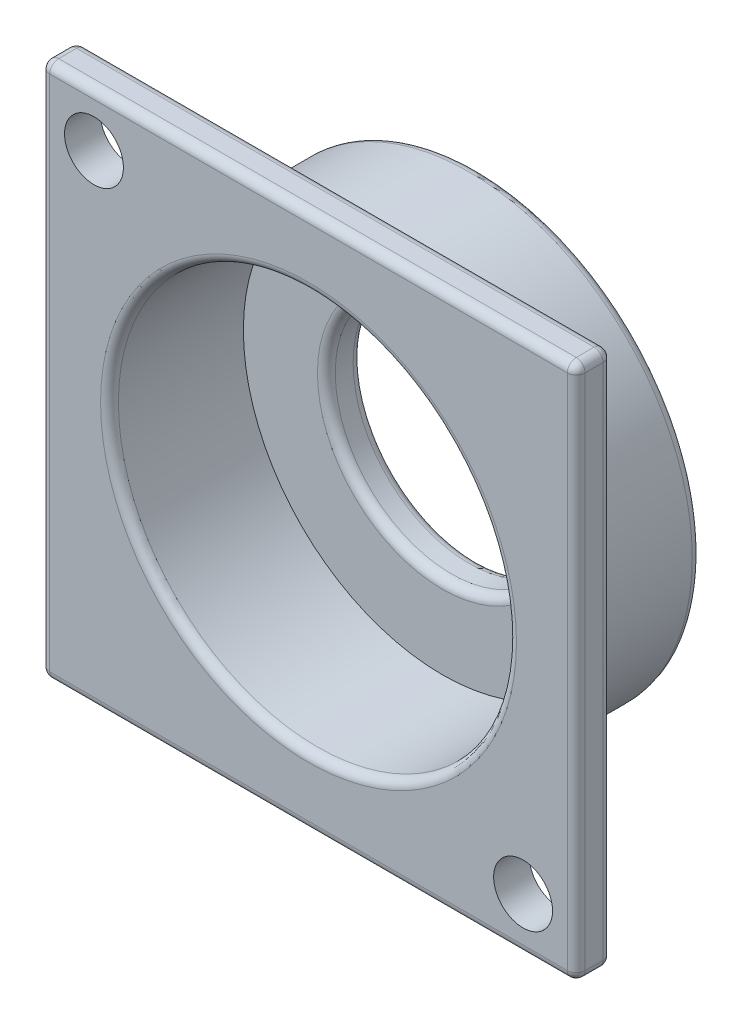
ISO-10303-21;
HEADER;
FILE_DESCRIPTION(('STEP AP214'),'2;1');
FILE_NAME('part.step','',(''),(''),'','','');
FILE_SCHEMA(('AUTOMOTIVE_DESIGN { 1 0 10303 214 1 1 1 1 }'));
ENDSEC;
DATA;
#1=APPLICATION_CONTEXT('core data for automotive mechanical design processes');
#2=APPLICATION_PROTOCOL_DEFINITION('international standard','automotive_design',2000,#1);
#3=PRODUCT_CONTEXT('',#1,'mechanical');
#4=PRODUCT('Part','Part','',(#3));
#5=PRODUCT_RELATED_PRODUCT_CATEGORY('part','',(#4));
#6=PRODUCT_DEFINITION_FORMATION('','',#4);
#7=PRODUCT_DEFINITION_CONTEXT('part definition',#1,'design');
#8=PRODUCT_DEFINITION('design','',#6,#7);
#9=PRODUCT_DEFINITION_SHAPE('','',#8);
#10=(LENGTH_UNIT() NAMED_UNIT(*) SI_UNIT(.MILLI.,.METRE.));
#11=(NAMED_UNIT(*) PLANE_ANGLE_UNIT() SI_UNIT($,.RADIAN.));
#12=(NAMED_UNIT(*) SI_UNIT($,.STERADIAN.) SOLID_ANGLE_UNIT());
#13=UNCERTAINTY_MEASURE_WITH_UNIT(LENGTH_MEASURE(1.E-05),#10,'distance_accuracy_value','');
#14=(GEOMETRIC_REPRESENTATION_CONTEXT(3) GLOBAL_UNCERTAINTY_ASSIGNED_CONTEXT((#13)) GLOBAL_UNIT_ASSIGNED_CONTEXT((#10,
#11,#12)) REPRESENTATION_CONTEXT('',''));
#15=CARTESIAN_POINT('',(0.,0.,0.));
#16=DIRECTION('',(0.,0.,1.));
#17=DIRECTION('',(1.,0.,0.));
#18=AXIS2_PLACEMENT_3D('',#15,#16,#17);
#19=CARTESIAN_POINT('',(-15.,0.,-2.));
#20=DIRECTION('',(1.,0.,0.));
#21=DIRECTION('',(0.,1.,0.));
#22=AXIS2_PLACEMENT_3D('',#19,#20,#21);
#23=PLANE('',#22);
#24=DIRECTION('',(0.,1.,0.));
#25=VECTOR('',#24,1.);
#26=CARTESIAN_POINT('',(-15.,0.,-1.5));
#27=LINE('',#26,#25);
#28=CARTESIAN_POINT('',(-15.,14.5,-1.5));
#29=VERTEX_POINT('',#28);
#30=CARTESIAN_POINT('',(-15.,-14.5,-1.5));
#31=VERTEX_POINT('',#30);
#32=EDGE_CURVE('E205',#29,#31,#27,.F.);
#33=ORIENTED_EDGE('',*,*,#32,.T.);
#34=DIRECTION('',(0.,0.,1.));
#35=VECTOR('',#34,1.);
#36=CARTESIAN_POINT('',(-15.,-14.5,-2.));
#37=LINE('',#36,#35);
#38=CARTESIAN_POINT('',(-15.,-14.5,-0.5));
#39=VERTEX_POINT('',#38);
#40=EDGE_CURVE('E207',#31,#39,#37,.T.);
#41=ORIENTED_EDGE('',*,*,#40,.T.);
#42=DIRECTION('',(0.,1.,0.));
#43=VECTOR('',#42,1.);
#44=CARTESIAN_POINT('',(-15.,15.,-0.5));
#45=LINE('',#44,#43);
#46=CARTESIAN_POINT('',(-15.,14.5,-0.5));
#47=VERTEX_POINT('',#46);
#48=EDGE_CURVE('E204',#39,#47,#45,.T.);
#49=ORIENTED_EDGE('',*,*,#48,.T.);
#50=DIRECTION('',(0.,0.,1.));
#51=VECTOR('',#50,1.);
#52=CARTESIAN_POINT('',(-15.,14.5,-2.));
#53=LINE('',#52,#51);
#54=EDGE_CURVE('E199',#47,#29,#53,.F.);
#55=ORIENTED_EDGE('',*,*,#54,.T.);
#56=EDGE_LOOP('',(#33,#41,#49,#55));
#57=FACE_BOUND('',#56,.T.);
#58=ADVANCED_FACE('F41',(#57),#23,.F.);
#59=CARTESIAN_POINT('',(0.,15.,-2.));
#60=DIRECTION('',(0.,1.,0.));
#61=DIRECTION('',(-1.,0.,0.));
#62=AXIS2_PLACEMENT_3D('',#59,#60,#61);
#63=PLANE('',#62);
#64=DIRECTION('',(-1.,0.,0.));
#65=VECTOR('',#64,1.);
#66=CARTESIAN_POINT('',(-15.,15.,-1.5));
#67=LINE('',#66,#65);
#68=CARTESIAN_POINT('',(14.5,15.,-1.5));
#69=VERTEX_POINT('',#68);
#70=CARTESIAN_POINT('',(-14.5,15.,-1.5));
#71=VERTEX_POINT('',#70);
#72=EDGE_CURVE('E146',#69,#71,#67,.T.);
#73=ORIENTED_EDGE('',*,*,#72,.T.);
#74=DIRECTION('',(0.,0.,1.));
#75=VECTOR('',#74,1.);
#76=CARTESIAN_POINT('',(-14.5,15.,0.));
#77=LINE('',#76,#75);
#78=CARTESIAN_POINT('',(-14.5,15.,-0.5));
#79=VERTEX_POINT('',#78);
#80=EDGE_CURVE('E211',#71,#79,#77,.T.);
#81=ORIENTED_EDGE('',*,*,#80,.T.);
#82=DIRECTION('',(-1.,0.,0.));
#83=VECTOR('',#82,1.);
#84=CARTESIAN_POINT('',(0.,15.,-0.5));
#85=LINE('',#84,#83);
#86=CARTESIAN_POINT('',(14.5,15.,-0.5));
#87=VERTEX_POINT('',#86);
#88=EDGE_CURVE('E212',#79,#87,#85,.F.);
#89=ORIENTED_EDGE('',*,*,#88,.T.);
#90=DIRECTION('',(0.,0.,1.));
#91=VECTOR('',#90,1.);
#92=CARTESIAN_POINT('',(14.5,15.,-2.));
#93=LINE('',#92,#91);
#94=EDGE_CURVE('E209',#87,#69,#93,.F.);
#95=ORIENTED_EDGE('',*,*,#94,.T.);
#96=EDGE_LOOP('',(#73,#81,#89,#95));
#97=FACE_BOUND('',#96,.T.);
#98=ADVANCED_FACE('F335',(#97),#63,.T.);
#99=CARTESIAN_POINT('',(15.,0.,-2.));
#100=DIRECTION('',(1.,0.,0.));
#101=DIRECTION('',(0.,1.,0.));
#102=AXIS2_PLACEMENT_3D('',#99,#100,#101);
#103=PLANE('',#102);
#104=DIRECTION('',(0.,1.,0.));
#105=VECTOR('',#104,1.);
#106=CARTESIAN_POINT('',(15.,15.,-1.5));
#107=LINE('',#106,#105);
#108=CARTESIAN_POINT('',(15.,-14.5,-1.5));
#109=VERTEX_POINT('',#108);
#110=CARTESIAN_POINT('',(15.,14.5,-1.5));
#111=VERTEX_POINT('',#110);
#112=EDGE_CURVE('E59',#109,#111,#107,.T.);
#113=ORIENTED_EDGE('',*,*,#112,.T.);
#114=DIRECTION('',(0.,0.,1.));
#115=VECTOR('',#114,1.);
#116=CARTESIAN_POINT('',(15.,14.5,-2.));
#117=LINE('',#116,#115);
#118=CARTESIAN_POINT('',(15.,14.5,-0.5));
#119=VERTEX_POINT('',#118);
#120=EDGE_CURVE('E223',#111,#119,#117,.T.);
#121=ORIENTED_EDGE('',*,*,#120,.T.);
#122=DIRECTION('',(0.,1.,0.));
#123=VECTOR('',#122,1.);
#124=CARTESIAN_POINT('',(15.,0.,-0.5));
#125=LINE('',#124,#123);
#126=CARTESIAN_POINT('',(15.,-14.5,-0.5));
#127=VERTEX_POINT('',#126);
#128=EDGE_CURVE('E220',#119,#127,#125,.F.);
#129=ORIENTED_EDGE('',*,*,#128,.T.);
#130=DIRECTION('',(0.,0.,1.));
#131=VECTOR('',#130,1.);
#132=CARTESIAN_POINT('',(15.,-14.5,-2.));
#133=LINE('',#132,#131);
#134=EDGE_CURVE('E64',#127,#109,#133,.F.);
#135=ORIENTED_EDGE('',*,*,#134,.T.);
#136=EDGE_LOOP('',(#113,#121,#129,#135));
#137=FACE_BOUND('',#136,.T.);
#138=ADVANCED_FACE('F342',(#137),#103,.T.);
#139=CARTESIAN_POINT('',(12.0208152801713,-12.0208152801714,-2.));
#140=DIRECTION('',(0.,0.,1.));
#141=DIRECTION('',(1.,0.,0.));
#142=AXIS2_PLACEMENT_3D('',#139,#140,#141);
#143=CYLINDRICAL_SURFACE('',#142,1.65);
#144=CARTESIAN_POINT('',(12.0208152801713,-12.0208152801714,-2.));
#145=DIRECTION('',(0.,0.,1.));
#146=DIRECTION('',(1.,0.,0.));
#147=AXIS2_PLACEMENT_3D('',#144,#145,#146);
#148=CIRCLE('',#147,1.65);
#149=CARTESIAN_POINT('',(13.6708152801713,-12.0208152801714,-2.));
#150=VERTEX_POINT('',#149);
#151=EDGE_CURVE('E170',#150,#150,#148,.T.);
#152=ORIENTED_EDGE('',*,*,#151,.F.);
#153=EDGE_LOOP('',(#152));
#154=FACE_BOUND('',#153,.T.);
#155=CARTESIAN_POINT('',(12.0208152801713,-12.0208152801714,0.));
#156=DIRECTION('',(0.,0.,1.));
#157=DIRECTION('',(1.,0.,0.));
#158=AXIS2_PLACEMENT_3D('',#155,#156,#157);
#159=CIRCLE('',#158,1.65);
#160=CARTESIAN_POINT('',(13.6708152801713,-12.0208152801714,0.));
#161=VERTEX_POINT('',#160);
#162=EDGE_CURVE('E173',#161,#161,#159,.T.);
#163=ORIENTED_EDGE('',*,*,#162,.T.);
#164=EDGE_LOOP('',(#163));
#165=FACE_BOUND('',#164,.T.);
#166=ADVANCED_FACE('F314',(#154,#165),#143,.F.);
#167=CARTESIAN_POINT('',(-12.0208152801712,12.0208152801714,-2.));
#168=DIRECTION('',(0.,0.,1.));
#169=DIRECTION('',(1.,0.,0.));
#170=AXIS2_PLACEMENT_3D('',#167,#168,#169);
#171=CYLINDRICAL_SURFACE('',#170,1.65);
#172=CARTESIAN_POINT('',(-12.0208152801712,12.0208152801714,-2.));
#173=DIRECTION('',(0.,0.,1.));
#174=DIRECTION('',(1.,0.,0.));
#175=AXIS2_PLACEMENT_3D('',#172,#173,#174);
#176=CIRCLE('',#175,1.65);
#177=CARTESIAN_POINT('',(-10.3708152801712,12.0208152801714,-2.));
#178=VERTEX_POINT('',#177);
#179=EDGE_CURVE('E167',#178,#178,#176,.T.);
#180=ORIENTED_EDGE('',*,*,#179,.F.);
#181=EDGE_LOOP('',(#180));
#182=FACE_BOUND('',#181,.T.);
#183=CARTESIAN_POINT('',(-12.0208152801712,12.0208152801714,0.));
#184=DIRECTION('',(0.,0.,1.));
#185=DIRECTION('',(1.,0.,0.));
#186=AXIS2_PLACEMENT_3D('',#183,#184,#185);
#187=CIRCLE('',#186,1.65);
#188=CARTESIAN_POINT('',(-10.3708152801712,12.0208152801714,0.));
#189=VERTEX_POINT('',#188);
#190=EDGE_CURVE('E304',#189,#189,#187,.T.);
#191=ORIENTED_EDGE('',*,*,#190,.T.);
#192=EDGE_LOOP('',(#191));
#193=FACE_BOUND('',#192,.T.);
#194=ADVANCED_FACE('F348',(#182,#193),#171,.F.);
#195=CARTESIAN_POINT('',(0.,0.,-2.));
#196=DIRECTION('',(0.,0.,1.));
#197=DIRECTION('',(1.,0.,0.));
#198=AXIS2_PLACEMENT_3D('',#195,#196,#197);
#199=CYLINDRICAL_SURFACE('',#198,11.15);
#200=CARTESIAN_POINT('',(0.,0.,-0.5));
#201=DIRECTION('',(0.,0.,1.));
#202=DIRECTION('',(1.,0.,0.));
#203=AXIS2_PLACEMENT_3D('',#200,#201,#202);
#204=CIRCLE('',#203,11.15);
#205=CARTESIAN_POINT('',(11.15,0.,-0.5));
#206=VERTEX_POINT('',#205);
#207=EDGE_CURVE('E222',#206,#206,#204,.T.);
#208=ORIENTED_EDGE('',*,*,#207,.T.);
#209=EDGE_LOOP('',(#208));
#210=FACE_BOUND('',#209,.T.);
#211=CARTESIAN_POINT('',(0.,0.,-7.5));
#212=DIRECTION('',(0.,0.,1.));
#213=DIRECTION('',(1.,0.,0.));
#214=AXIS2_PLACEMENT_3D('',#211,#212,#213);
#215=CIRCLE('',#214,11.15);
#216=CARTESIAN_POINT('',(11.15,0.,-7.5));
#217=VERTEX_POINT('',#216);
#218=EDGE_CURVE('E295',#217,#217,#215,.T.);
#219=ORIENTED_EDGE('',*,*,#218,.F.);
#220=EDGE_LOOP('',(#219));
#221=FACE_BOUND('',#220,.T.);
#222=ADVANCED_FACE('F353',(#210,#221),#199,.F.);
#223=CARTESIAN_POINT('',(0.,-15.,-2.));
#224=DIRECTION('',(0.,1.,0.));
#225=DIRECTION('',(-1.,0.,0.));
#226=AXIS2_PLACEMENT_3D('',#223,#224,#225);
#227=PLANE('',#226);
#228=DIRECTION('',(-1.,0.,0.));
#229=VECTOR('',#228,1.);
#230=CARTESIAN_POINT('',(-15.,-15.,-0.5));
#231=LINE('',#230,#229);
#232=CARTESIAN_POINT('',(14.5,-15.,-0.5));
#233=VERTEX_POINT('',#232);
#234=CARTESIAN_POINT('',(-14.5,-15.,-0.5));
#235=VERTEX_POINT('',#234);
#236=EDGE_CURVE('E181',#233,#235,#231,.T.);
#237=ORIENTED_EDGE('',*,*,#236,.T.);
#238=DIRECTION('',(0.,0.,1.));
#239=VECTOR('',#238,1.);
#240=CARTESIAN_POINT('',(-14.5,-15.,-2.));
#241=LINE('',#240,#239);
#242=CARTESIAN_POINT('',(-14.5,-15.,-1.5));
#243=VERTEX_POINT('',#242);
#244=EDGE_CURVE('E187',#235,#243,#241,.F.);
#245=ORIENTED_EDGE('',*,*,#244,.T.);
#246=DIRECTION('',(-1.,0.,0.));
#247=VECTOR('',#246,1.);
#248=CARTESIAN_POINT('',(0.,-15.,-1.5));
#249=LINE('',#248,#247);
#250=CARTESIAN_POINT('',(14.5,-15.,-1.5));
#251=VERTEX_POINT('',#250);
#252=EDGE_CURVE('E182',#243,#251,#249,.F.);
#253=ORIENTED_EDGE('',*,*,#252,.T.);
#254=DIRECTION('',(0.,0.,1.));
#255=VECTOR('',#254,1.);
#256=CARTESIAN_POINT('',(14.5,-15.,0.));
#257=LINE('',#256,#255);
#258=EDGE_CURVE('E177',#251,#233,#257,.T.);
#259=ORIENTED_EDGE('',*,*,#258,.T.);
#260=EDGE_LOOP('',(#237,#245,#253,#259));
#261=FACE_BOUND('',#260,.T.);
#262=ADVANCED_FACE('F327',(#261),#227,.F.);
#263=CARTESIAN_POINT('',(0.,0.,-2.));
#264=DIRECTION('',(0.,0.,1.));
#265=DIRECTION('',(1.,0.,0.));
#266=AXIS2_PLACEMENT_3D('',#263,#264,#265);
#267=PLANE('',#266);
#268=DIRECTION('',(0.,1.,0.));
#269=VECTOR('',#268,1.);
#270=CARTESIAN_POINT('',(14.5,-15.,-2.));
#271=LINE('',#270,#269);
#272=CARTESIAN_POINT('',(14.5,14.5,-2.));
#273=VERTEX_POINT('',#272);
#274=CARTESIAN_POINT('',(14.5,-14.5,-2.));
#275=VERTEX_POINT('',#274);
#276=EDGE_CURVE('E138',#273,#275,#271,.F.);
#277=ORIENTED_EDGE('',*,*,#276,.T.);
#278=DIRECTION('',(-1.,0.,0.));
#279=VECTOR('',#278,1.);
#280=CARTESIAN_POINT('',(0.,-14.5,-2.));
#281=LINE('',#280,#279);
#282=CARTESIAN_POINT('',(-14.5,-14.5,-2.));
#283=VERTEX_POINT('',#282);
#284=EDGE_CURVE('E180',#275,#283,#281,.T.);
#285=ORIENTED_EDGE('',*,*,#284,.T.);
#286=DIRECTION('',(0.,1.,0.));
#287=VECTOR('',#286,1.);
#288=CARTESIAN_POINT('',(-14.5,0.,-2.));
#289=LINE('',#288,#287);
#290=CARTESIAN_POINT('',(-14.5,14.5,-2.));
#291=VERTEX_POINT('',#290);
#292=EDGE_CURVE('E140',#283,#291,#289,.T.);
#293=ORIENTED_EDGE('',*,*,#292,.T.);
#294=DIRECTION('',(-1.,0.,0.));
#295=VECTOR('',#294,1.);
#296=CARTESIAN_POINT('',(15.,14.5,-2.));
#297=LINE('',#296,#295);
#298=EDGE_CURVE('E128',#291,#273,#297,.F.);
#299=ORIENTED_EDGE('',*,*,#298,.T.);
#300=EDGE_LOOP('',(#277,#285,#293,#299));
#301=FACE_BOUND('',#300,.T.);
#302=CARTESIAN_POINT('',(0.,0.,-2.));
#303=DIRECTION('',(0.,0.,1.));
#304=DIRECTION('',(1.,0.,0.));
#305=AXIS2_PLACEMENT_3D('',#302,#303,#304);
#306=CIRCLE('',#305,12.5);
#307=CARTESIAN_POINT('',(12.5,0.,-2.));
#308=VERTEX_POINT('',#307);
#309=EDGE_CURVE('E297',#308,#308,#306,.T.);
#310=ORIENTED_EDGE('',*,*,#309,.T.);
#311=EDGE_LOOP('',(#310));
#312=FACE_BOUND('',#311,.T.);
#313=ORIENTED_EDGE('',*,*,#179,.T.);
#314=EDGE_LOOP('',(#313));
#315=FACE_BOUND('',#314,.T.);
#316=ORIENTED_EDGE('',*,*,#151,.T.);
#317=EDGE_LOOP('',(#316));
#318=FACE_BOUND('',#317,.T.);
#319=ADVANCED_FACE('F135',(#301,#312,#315,#318),#267,.F.);
#320=CARTESIAN_POINT('',(0.,0.,0.));
#321=DIRECTION('',(0.,0.,1.));
#322=DIRECTION('',(1.,0.,0.));
#323=AXIS2_PLACEMENT_3D('',#320,#321,#322);
#324=PLANE('',#323);
#325=DIRECTION('',(0.,1.,0.));
#326=VECTOR('',#325,1.);
#327=CARTESIAN_POINT('',(-14.5,-15.,0.));
#328=LINE('',#327,#326);
#329=CARTESIAN_POINT('',(-14.5,14.5,0.));
#330=VERTEX_POINT('',#329);
#331=CARTESIAN_POINT('',(-14.5,-14.5,0.));
#332=VERTEX_POINT('',#331);
#333=EDGE_CURVE('E193',#330,#332,#328,.F.);
#334=ORIENTED_EDGE('',*,*,#333,.T.);
#335=DIRECTION('',(-1.,0.,0.));
#336=VECTOR('',#335,1.);
#337=CARTESIAN_POINT('',(15.,-14.5,0.));
#338=LINE('',#337,#336);
#339=CARTESIAN_POINT('',(14.5,-14.5,0.));
#340=VERTEX_POINT('',#339);
#341=EDGE_CURVE('E200',#332,#340,#338,.F.);
#342=ORIENTED_EDGE('',*,*,#341,.T.);
#343=DIRECTION('',(0.,1.,0.));
#344=VECTOR('',#343,1.);
#345=CARTESIAN_POINT('',(14.5,0.,0.));
#346=LINE('',#345,#344);
#347=CARTESIAN_POINT('',(14.5,14.5,0.));
#348=VERTEX_POINT('',#347);
#349=EDGE_CURVE('E192',#340,#348,#346,.T.);
#350=ORIENTED_EDGE('',*,*,#349,.T.);
#351=DIRECTION('',(-1.,0.,0.));
#352=VECTOR('',#351,1.);
#353=CARTESIAN_POINT('',(0.,14.5,0.));
#354=LINE('',#353,#352);
#355=EDGE_CURVE('E194',#348,#330,#354,.T.);
#356=ORIENTED_EDGE('',*,*,#355,.T.);
#357=EDGE_LOOP('',(#334,#342,#350,#356));
#358=FACE_BOUND('',#357,.T.);
#359=CARTESIAN_POINT('',(0.,0.,0.));
#360=DIRECTION('',(0.,0.,1.));
#361=DIRECTION('',(1.,0.,0.));
#362=AXIS2_PLACEMENT_3D('',#359,#360,#361);
#363=CIRCLE('',#362,11.65);
#364=CARTESIAN_POINT('',(11.65,0.,0.));
#365=VERTEX_POINT('',#364);
#366=EDGE_CURVE('E189',#365,#365,#363,.F.);
#367=ORIENTED_EDGE('',*,*,#366,.T.);
#368=EDGE_LOOP('',(#367));
#369=FACE_BOUND('',#368,.T.);
#370=ORIENTED_EDGE('',*,*,#190,.F.);
#371=EDGE_LOOP('',(#370));
#372=FACE_BOUND('',#371,.T.);
#373=ORIENTED_EDGE('',*,*,#162,.F.);
#374=EDGE_LOOP('',(#373));
#375=FACE_BOUND('',#374,.T.);
#376=ADVANCED_FACE('F320',(#358,#369,#372,#375),#324,.T.);
#377=CARTESIAN_POINT('',(0.,0.,-7.5));
#378=DIRECTION('',(0.,0.,1.));
#379=DIRECTION('',(1.,0.,0.));
#380=AXIS2_PLACEMENT_3D('',#377,#378,#379);
#381=CYLINDRICAL_SURFACE('',#380,12.5);
#382=CARTESIAN_POINT('',(0.,0.,-9.));
#383=DIRECTION('',(0.,0.,-1.));
#384=DIRECTION('',(-1.,0.,0.));
#385=AXIS2_PLACEMENT_3D('',#382,#383,#384);
#386=CIRCLE('',#385,12.5);
#387=CARTESIAN_POINT('',(-12.5,0.,-9.));
#388=VERTEX_POINT('',#387);
#389=EDGE_CURVE('E235',#388,#388,#386,.F.);
#390=ORIENTED_EDGE('',*,*,#389,.T.);
#391=EDGE_LOOP('',(#390));
#392=FACE_BOUND('',#391,.T.);
#393=ORIENTED_EDGE('',*,*,#309,.F.);
#394=EDGE_LOOP('',(#393));
#395=FACE_BOUND('',#394,.T.);
#396=ADVANCED_FACE('F316',(#392,#395),#381,.T.);
#397=CARTESIAN_POINT('',(0.,0.,-7.5));
#398=DIRECTION('',(0.,0.,-1.));
#399=DIRECTION('',(-1.,0.,0.));
#400=AXIS2_PLACEMENT_3D('',#397,#398,#399);
#401=PLANE('',#400);
#402=CARTESIAN_POINT('',(0.,0.,-7.5));
#403=DIRECTION('',(0.,0.,-1.));
#404=DIRECTION('',(-1.,0.,0.));
#405=AXIS2_PLACEMENT_3D('',#402,#403,#404);
#406=CIRCLE('',#405,7.);
#407=CARTESIAN_POINT('',(-7.,0.,-7.5));
#408=VERTEX_POINT('',#407);
#409=EDGE_CURVE('E232',#408,#408,#406,.T.);
#410=ORIENTED_EDGE('',*,*,#409,.T.);
#411=EDGE_LOOP('',(#410));
#412=FACE_BOUND('',#411,.T.);
#413=ORIENTED_EDGE('',*,*,#218,.T.);
#414=EDGE_LOOP('',(#413));
#415=FACE_BOUND('',#414,.T.);
#416=ADVANCED_FACE('F326',(#412,#415),#401,.F.);
#417=CARTESIAN_POINT('',(0.,0.,-9.5));
#418=DIRECTION('',(0.,0.,-1.));
#419=DIRECTION('',(-1.,0.,0.));
#420=AXIS2_PLACEMENT_3D('',#417,#418,#419);
#421=PLANE('',#420);
#422=CARTESIAN_POINT('',(0.,0.,-9.5));
#423=DIRECTION('',(0.,0.,-1.));
#424=DIRECTION('',(-1.,0.,0.));
#425=AXIS2_PLACEMENT_3D('',#422,#423,#424);
#426=CIRCLE('',#425,12.);
#427=CARTESIAN_POINT('',(-12.,0.,-9.5));
#428=VERTEX_POINT('',#427);
#429=EDGE_CURVE('E230',#428,#428,#426,.T.);
#430=ORIENTED_EDGE('',*,*,#429,.T.);
#431=EDGE_LOOP('',(#430));
#432=FACE_BOUND('',#431,.T.);
#433=CARTESIAN_POINT('',(0.,0.,-9.5));
#434=DIRECTION('',(0.,0.,-1.));
#435=DIRECTION('',(-1.,0.,0.));
#436=AXIS2_PLACEMENT_3D('',#433,#434,#435);
#437=CIRCLE('',#436,7.);
#438=CARTESIAN_POINT('',(-7.,0.,-9.5));
#439=VERTEX_POINT('',#438);
#440=EDGE_CURVE('E228',#439,#439,#437,.F.);
#441=ORIENTED_EDGE('',*,*,#440,.T.);
#442=EDGE_LOOP('',(#441));
#443=FACE_BOUND('',#442,.T.);
#444=ADVANCED_FACE('F449',(#432,#443),#421,.T.);
#445=CARTESIAN_POINT('',(0.,0.,-9.5));
#446=DIRECTION('',(0.,0.,1.));
#447=DIRECTION('',(1.,0.,0.));
#448=AXIS2_PLACEMENT_3D('',#445,#446,#447);
#449=CYLINDRICAL_SURFACE('',#448,6.5);
#450=CARTESIAN_POINT('',(0.,0.,-8.));
#451=DIRECTION('',(0.,0.,-1.));
#452=DIRECTION('',(-1.,0.,0.));
#453=AXIS2_PLACEMENT_3D('',#450,#451,#452);
#454=CIRCLE('',#453,6.5);
#455=CARTESIAN_POINT('',(-6.5,0.,-8.));
#456=VERTEX_POINT('',#455);
#457=EDGE_CURVE('E11',#456,#456,#454,.F.);
#458=ORIENTED_EDGE('',*,*,#457,.T.);
#459=EDGE_LOOP('',(#458));
#460=FACE_BOUND('',#459,.T.);
#461=CARTESIAN_POINT('',(0.,0.,-9.));
#462=DIRECTION('',(0.,0.,-1.));
#463=DIRECTION('',(-1.,0.,0.));
#464=AXIS2_PLACEMENT_3D('',#461,#462,#463);
#465=CIRCLE('',#464,6.5);
#466=CARTESIAN_POINT('',(-6.5,0.,-9.));
#467=VERTEX_POINT('',#466);
#468=EDGE_CURVE('E49',#467,#467,#465,.T.);
#469=ORIENTED_EDGE('',*,*,#468,.T.);
#470=EDGE_LOOP('',(#469));
#471=FACE_BOUND('',#470,.T.);
#472=ADVANCED_FACE('F426',(#460,#471),#449,.F.);
#473=CARTESIAN_POINT('',(0.,14.5,-0.5));
#474=DIRECTION('',(-1.,0.,0.));
#475=DIRECTION('',(0.,-1.,0.));
#476=AXIS2_PLACEMENT_3D('',#473,#474,#475);
#477=CYLINDRICAL_SURFACE('',#476,0.5);
#478=CARTESIAN_POINT('',(14.5,14.5,-0.5));
#479=DIRECTION('',(1.,0.,0.));
#480=DIRECTION('',(0.,0.,-1.));
#481=AXIS2_PLACEMENT_3D('',#478,#479,#480);
#482=CIRCLE('',#481,0.5);
#483=EDGE_CURVE('E44',#87,#348,#482,.T.);
#484=ORIENTED_EDGE('',*,*,#483,.F.);
#485=ORIENTED_EDGE('',*,*,#88,.F.);
#486=CARTESIAN_POINT('',(-14.5,14.5,-0.5));
#487=DIRECTION('',(-1.,0.,0.));
#488=DIRECTION('',(0.,0.,1.));
#489=AXIS2_PLACEMENT_3D('',#486,#487,#488);
#490=CIRCLE('',#489,0.5);
#491=EDGE_CURVE('E288',#330,#79,#490,.T.);
#492=ORIENTED_EDGE('',*,*,#491,.F.);
#493=ORIENTED_EDGE('',*,*,#355,.F.);
#494=EDGE_LOOP('',(#484,#485,#492,#493));
#495=FACE_BOUND('',#494,.T.);
#496=ADVANCED_FACE('F424',(#495),#477,.T.);
#497=CARTESIAN_POINT('',(14.5,14.5,-0.5));
#498=DIRECTION('',(0.,0.,1.));
#499=DIRECTION('',(1.,0.,0.));
#500=AXIS2_PLACEMENT_3D('',#497,#498,#499);
#501=SPHERICAL_SURFACE('',#500,0.5);
#502=CARTESIAN_POINT('',(14.5,14.5,-0.5));
#503=DIRECTION('',(0.,0.,1.));
#504=DIRECTION('',(1.,0.,0.));
#505=AXIS2_PLACEMENT_3D('',#502,#503,#504);
#506=CIRCLE('',#505,0.5);
#507=EDGE_CURVE('E281',#87,#119,#506,.F.);
#508=ORIENTED_EDGE('',*,*,#507,.F.);
#509=ORIENTED_EDGE('',*,*,#483,.T.);
#510=CARTESIAN_POINT('',(14.5,14.5,-0.5));
#511=DIRECTION('',(0.,1.,0.));
#512=DIRECTION('',(0.,0.,1.));
#513=AXIS2_PLACEMENT_3D('',#510,#511,#512);
#514=CIRCLE('',#513,0.5);
#515=EDGE_CURVE('E282',#119,#348,#514,.F.);
#516=ORIENTED_EDGE('',*,*,#515,.F.);
#517=EDGE_LOOP('',(#508,#509,#516));
#518=FACE_BOUND('',#517,.T.);
#519=ADVANCED_FACE('F422',(#518),#501,.T.);
#520=CARTESIAN_POINT('',(-14.5,14.5,-0.5));
#521=DIRECTION('',(0.,1.,0.));
#522=DIRECTION('',(0.,0.,1.));
#523=AXIS2_PLACEMENT_3D('',#520,#521,#522);
#524=SPHERICAL_SURFACE('',#523,0.5);
#525=CARTESIAN_POINT('',(-14.5,14.5,-0.5));
#526=DIRECTION('',(0.,1.,0.));
#527=DIRECTION('',(0.,0.,1.));
#528=AXIS2_PLACEMENT_3D('',#525,#526,#527);
#529=CIRCLE('',#528,0.5);
#530=EDGE_CURVE('E277',#330,#47,#529,.F.);
#531=ORIENTED_EDGE('',*,*,#530,.F.);
#532=ORIENTED_EDGE('',*,*,#491,.T.);
#533=CARTESIAN_POINT('',(-14.5,14.5,-0.5));
#534=DIRECTION('',(0.,0.,1.));
#535=DIRECTION('',(1.,0.,0.));
#536=AXIS2_PLACEMENT_3D('',#533,#534,#535);
#537=CIRCLE('',#536,0.5);
#538=EDGE_CURVE('E276',#47,#79,#537,.F.);
#539=ORIENTED_EDGE('',*,*,#538,.F.);
#540=EDGE_LOOP('',(#531,#532,#539));
#541=FACE_BOUND('',#540,.T.);
#542=ADVANCED_FACE('F417',(#541),#524,.T.);
#543=CARTESIAN_POINT('',(14.5,0.,-0.5));
#544=DIRECTION('',(0.,1.,0.));
#545=DIRECTION('',(-1.,0.,0.));
#546=AXIS2_PLACEMENT_3D('',#543,#544,#545);
#547=CYLINDRICAL_SURFACE('',#546,0.5);
#548=ORIENTED_EDGE('',*,*,#515,.T.);
#549=ORIENTED_EDGE('',*,*,#349,.F.);
#550=CARTESIAN_POINT('',(14.5,-14.5,-0.5));
#551=DIRECTION('',(0.,-1.,0.));
#552=DIRECTION('',(0.,0.,-1.));
#553=AXIS2_PLACEMENT_3D('',#550,#551,#552);
#554=CIRCLE('',#553,0.5);
#555=EDGE_CURVE('E272',#127,#340,#554,.T.);
#556=ORIENTED_EDGE('',*,*,#555,.F.);
#557=ORIENTED_EDGE('',*,*,#128,.F.);
#558=EDGE_LOOP('',(#548,#549,#556,#557));
#559=FACE_BOUND('',#558,.T.);
#560=ADVANCED_FACE('F412',(#559),#547,.T.);
#561=CARTESIAN_POINT('',(14.5,14.5,-2.));
#562=DIRECTION('',(0.,0.,1.));
#563=DIRECTION('',(1.,0.,0.));
#564=AXIS2_PLACEMENT_3D('',#561,#562,#563);
#565=CYLINDRICAL_SURFACE('',#564,0.5);
#566=ORIENTED_EDGE('',*,*,#507,.T.);
#567=ORIENTED_EDGE('',*,*,#120,.F.);
#568=CARTESIAN_POINT('',(14.5,14.5,-1.5));
#569=DIRECTION('',(0.,0.,-1.));
#570=DIRECTION('',(-1.,0.,0.));
#571=AXIS2_PLACEMENT_3D('',#568,#569,#570);
#572=CIRCLE('',#571,0.5);
#573=EDGE_CURVE('E153',#69,#111,#572,.T.);
#574=ORIENTED_EDGE('',*,*,#573,.F.);
#575=ORIENTED_EDGE('',*,*,#94,.F.);
#576=EDGE_LOOP('',(#566,#567,#574,#575));
#577=FACE_BOUND('',#576,.T.);
#578=ADVANCED_FACE('F411',(#577),#565,.T.);
#579=CARTESIAN_POINT('',(0.,14.5,-1.5));
#580=DIRECTION('',(1.,0.,0.));
#581=DIRECTION('',(0.,1.,0.));
#582=AXIS2_PLACEMENT_3D('',#579,#580,#581);
#583=CYLINDRICAL_SURFACE('',#582,0.5);
#584=CARTESIAN_POINT('',(-14.5,14.5,-1.5));
#585=DIRECTION('',(-1.,0.,0.));
#586=DIRECTION('',(0.,0.,1.));
#587=AXIS2_PLACEMENT_3D('',#584,#585,#586);
#588=CIRCLE('',#587,0.5);
#589=EDGE_CURVE('E152',#71,#291,#588,.T.);
#590=ORIENTED_EDGE('',*,*,#589,.F.);
#591=ORIENTED_EDGE('',*,*,#72,.F.);
#592=CARTESIAN_POINT('',(14.5,14.5,-1.5));
#593=DIRECTION('',(1.,0.,0.));
#594=DIRECTION('',(0.,0.,-1.));
#595=AXIS2_PLACEMENT_3D('',#592,#593,#594);
#596=CIRCLE('',#595,0.5);
#597=EDGE_CURVE('E147',#273,#69,#596,.T.);
#598=ORIENTED_EDGE('',*,*,#597,.F.);
#599=ORIENTED_EDGE('',*,*,#298,.F.);
#600=EDGE_LOOP('',(#590,#591,#598,#599));
#601=FACE_BOUND('',#600,.T.);
#602=ADVANCED_FACE('F149',(#601),#583,.T.);
#603=CARTESIAN_POINT('',(-14.5,14.5,-2.));
#604=DIRECTION('',(0.,0.,-1.));
#605=DIRECTION('',(-1.,0.,0.));
#606=AXIS2_PLACEMENT_3D('',#603,#604,#605);
#607=CYLINDRICAL_SURFACE('',#606,0.5);
#608=ORIENTED_EDGE('',*,*,#538,.T.);
#609=ORIENTED_EDGE('',*,*,#80,.F.);
#610=CARTESIAN_POINT('',(-14.5,14.5,-1.5));
#611=DIRECTION('',(0.,0.,-1.));
#612=DIRECTION('',(-1.,0.,0.));
#613=AXIS2_PLACEMENT_3D('',#610,#611,#612);
#614=CIRCLE('',#613,0.5);
#615=EDGE_CURVE('E268',#29,#71,#614,.T.);
#616=ORIENTED_EDGE('',*,*,#615,.F.);
#617=ORIENTED_EDGE('',*,*,#54,.F.);
#618=EDGE_LOOP('',(#608,#609,#616,#617));
#619=FACE_BOUND('',#618,.T.);
#620=ADVANCED_FACE('F404',(#619),#607,.T.);
#621=CARTESIAN_POINT('',(-14.5,0.,-0.5));
#622=DIRECTION('',(0.,-1.,0.));
#623=DIRECTION('',(1.,0.,0.));
#624=AXIS2_PLACEMENT_3D('',#621,#622,#623);
#625=CYLINDRICAL_SURFACE('',#624,0.5);
#626=ORIENTED_EDGE('',*,*,#530,.T.);
#627=ORIENTED_EDGE('',*,*,#48,.F.);
#628=CARTESIAN_POINT('',(-14.5,-14.5,-0.5));
#629=DIRECTION('',(0.,-1.,0.));
#630=DIRECTION('',(0.,0.,-1.));
#631=AXIS2_PLACEMENT_3D('',#628,#629,#630);
#632=CIRCLE('',#631,0.5);
#633=EDGE_CURVE('E263',#332,#39,#632,.T.);
#634=ORIENTED_EDGE('',*,*,#633,.F.);
#635=ORIENTED_EDGE('',*,*,#333,.F.);
#636=EDGE_LOOP('',(#626,#627,#634,#635));
#637=FACE_BOUND('',#636,.T.);
#638=ADVANCED_FACE('F396',(#637),#625,.T.);
#639=CARTESIAN_POINT('',(0.,-14.5,-0.5));
#640=DIRECTION('',(1.,0.,0.));
#641=DIRECTION('',(0.,1.,0.));
#642=AXIS2_PLACEMENT_3D('',#639,#640,#641);
#643=CYLINDRICAL_SURFACE('',#642,0.5);
#644=CARTESIAN_POINT('',(14.5,-14.5,-0.5));
#645=DIRECTION('',(1.,0.,0.));
#646=DIRECTION('',(0.,0.,-1.));
#647=AXIS2_PLACEMENT_3D('',#644,#645,#646);
#648=CIRCLE('',#647,0.5);
#649=EDGE_CURVE('E271',#340,#233,#648,.T.);
#650=ORIENTED_EDGE('',*,*,#649,.F.);
#651=ORIENTED_EDGE('',*,*,#341,.F.);
#652=CARTESIAN_POINT('',(-14.5,-14.5,-0.5));
#653=DIRECTION('',(-1.,0.,0.));
#654=DIRECTION('',(0.,0.,1.));
#655=AXIS2_PLACEMENT_3D('',#652,#653,#654);
#656=CIRCLE('',#655,0.5);
#657=EDGE_CURVE('E258',#235,#332,#656,.T.);
#658=ORIENTED_EDGE('',*,*,#657,.F.);
#659=ORIENTED_EDGE('',*,*,#236,.F.);
#660=EDGE_LOOP('',(#650,#651,#658,#659));
#661=FACE_BOUND('',#660,.T.);
#662=ADVANCED_FACE('F398',(#661),#643,.T.);
#663=CARTESIAN_POINT('',(14.5,-14.5,-0.5));
#664=DIRECTION('',(0.,0.,1.));
#665=DIRECTION('',(1.,0.,0.));
#666=AXIS2_PLACEMENT_3D('',#663,#664,#665);
#667=SPHERICAL_SURFACE('',#666,0.5);
#668=ORIENTED_EDGE('',*,*,#555,.T.);
#669=ORIENTED_EDGE('',*,*,#649,.T.);
#670=CARTESIAN_POINT('',(14.5,-14.5,-0.5));
#671=DIRECTION('',(0.,0.,1.));
#672=DIRECTION('',(1.,0.,0.));
#673=AXIS2_PLACEMENT_3D('',#670,#671,#672);
#674=CIRCLE('',#673,0.5);
#675=EDGE_CURVE('E156',#127,#233,#674,.F.);
#676=ORIENTED_EDGE('',*,*,#675,.F.);
#677=EDGE_LOOP('',(#668,#669,#676));
#678=FACE_BOUND('',#677,.T.);
#679=ADVANCED_FACE('F393',(#678),#667,.T.);
#680=CARTESIAN_POINT('',(14.5,14.5,-1.5));
#681=DIRECTION('',(0.,1.,0.));
#682=DIRECTION('',(0.,0.,1.));
#683=AXIS2_PLACEMENT_3D('',#680,#681,#682);
#684=SPHERICAL_SURFACE('',#683,0.5);
#685=ORIENTED_EDGE('',*,*,#597,.T.);
#686=ORIENTED_EDGE('',*,*,#573,.T.);
#687=CARTESIAN_POINT('',(14.5,14.5,-1.5));
#688=DIRECTION('',(0.,1.,0.));
#689=DIRECTION('',(0.,0.,1.));
#690=AXIS2_PLACEMENT_3D('',#687,#688,#689);
#691=CIRCLE('',#690,0.5);
#692=EDGE_CURVE('E159',#273,#111,#691,.F.);
#693=ORIENTED_EDGE('',*,*,#692,.F.);
#694=EDGE_LOOP('',(#685,#686,#693));
#695=FACE_BOUND('',#694,.T.);
#696=ADVANCED_FACE('F157',(#695),#684,.T.);
#697=CARTESIAN_POINT('',(-14.5,14.5,-1.5));
#698=DIRECTION('',(0.,1.,0.));
#699=DIRECTION('',(0.,0.,1.));
#700=AXIS2_PLACEMENT_3D('',#697,#698,#699);
#701=SPHERICAL_SURFACE('',#700,0.5);
#702=ORIENTED_EDGE('',*,*,#615,.T.);
#703=ORIENTED_EDGE('',*,*,#589,.T.);
#704=CARTESIAN_POINT('',(-14.5,14.5,-1.5));
#705=DIRECTION('',(0.,1.,0.));
#706=DIRECTION('',(0.,0.,1.));
#707=AXIS2_PLACEMENT_3D('',#704,#705,#706);
#708=CIRCLE('',#707,0.5);
#709=EDGE_CURVE('E163',#29,#291,#708,.F.);
#710=ORIENTED_EDGE('',*,*,#709,.F.);
#711=EDGE_LOOP('',(#702,#703,#710));
#712=FACE_BOUND('',#711,.T.);
#713=ADVANCED_FACE('F387',(#712),#701,.T.);
#714=CARTESIAN_POINT('',(-14.5,-14.5,-0.5));
#715=DIRECTION('',(0.,0.,1.));
#716=DIRECTION('',(1.,0.,0.));
#717=AXIS2_PLACEMENT_3D('',#714,#715,#716);
#718=SPHERICAL_SURFACE('',#717,0.5);
#719=ORIENTED_EDGE('',*,*,#657,.T.);
#720=ORIENTED_EDGE('',*,*,#633,.T.);
#721=CARTESIAN_POINT('',(-14.5,-14.5,-0.5));
#722=DIRECTION('',(0.,0.,1.));
#723=DIRECTION('',(1.,0.,0.));
#724=AXIS2_PLACEMENT_3D('',#721,#722,#723);
#725=CIRCLE('',#724,0.5);
#726=EDGE_CURVE('E251',#235,#39,#725,.F.);
#727=ORIENTED_EDGE('',*,*,#726,.F.);
#728=EDGE_LOOP('',(#719,#720,#727));
#729=FACE_BOUND('',#728,.T.);
#730=ADVANCED_FACE('F385',(#729),#718,.T.);
#731=CARTESIAN_POINT('',(14.5,-14.5,-2.));
#732=DIRECTION('',(0.,0.,-1.));
#733=DIRECTION('',(-1.,0.,0.));
#734=AXIS2_PLACEMENT_3D('',#731,#732,#733);
#735=CYLINDRICAL_SURFACE('',#734,0.5);
#736=ORIENTED_EDGE('',*,*,#675,.T.);
#737=ORIENTED_EDGE('',*,*,#258,.F.);
#738=CARTESIAN_POINT('',(14.5,-14.5,-1.5));
#739=DIRECTION('',(0.,0.,-1.));
#740=DIRECTION('',(-1.,0.,0.));
#741=AXIS2_PLACEMENT_3D('',#738,#739,#740);
#742=CIRCLE('',#741,0.5);
#743=EDGE_CURVE('E252',#109,#251,#742,.T.);
#744=ORIENTED_EDGE('',*,*,#743,.F.);
#745=ORIENTED_EDGE('',*,*,#134,.F.);
#746=EDGE_LOOP('',(#736,#737,#744,#745));
#747=FACE_BOUND('',#746,.T.);
#748=ADVANCED_FACE('F378',(#747),#735,.T.);
#749=CARTESIAN_POINT('',(14.5,0.,-1.5));
#750=DIRECTION('',(0.,-1.,0.));
#751=DIRECTION('',(1.,0.,0.));
#752=AXIS2_PLACEMENT_3D('',#749,#750,#751);
#753=CYLINDRICAL_SURFACE('',#752,0.5);
#754=ORIENTED_EDGE('',*,*,#692,.T.);
#755=ORIENTED_EDGE('',*,*,#112,.F.);
#756=CARTESIAN_POINT('',(14.5,-14.5,-1.5));
#757=DIRECTION('',(0.,-1.,0.));
#758=DIRECTION('',(0.,0.,-1.));
#759=AXIS2_PLACEMENT_3D('',#756,#757,#758);
#760=CIRCLE('',#759,0.5);
#761=EDGE_CURVE('E164',#275,#109,#760,.T.);
#762=ORIENTED_EDGE('',*,*,#761,.F.);
#763=ORIENTED_EDGE('',*,*,#276,.F.);
#764=EDGE_LOOP('',(#754,#755,#762,#763));
#765=FACE_BOUND('',#764,.T.);
#766=ADVANCED_FACE('F161',(#765),#753,.T.);
#767=CARTESIAN_POINT('',(-14.5,0.,-1.5));
#768=DIRECTION('',(0.,1.,0.));
#769=DIRECTION('',(-1.,0.,0.));
#770=AXIS2_PLACEMENT_3D('',#767,#768,#769);
#771=CYLINDRICAL_SURFACE('',#770,0.5);
#772=ORIENTED_EDGE('',*,*,#709,.T.);
#773=ORIENTED_EDGE('',*,*,#292,.F.);
#774=CARTESIAN_POINT('',(-14.5,-14.5,-1.5));
#775=DIRECTION('',(0.,-1.,0.));
#776=DIRECTION('',(0.,0.,-1.));
#777=AXIS2_PLACEMENT_3D('',#774,#775,#776);
#778=CIRCLE('',#777,0.5);
#779=EDGE_CURVE('E250',#31,#283,#778,.T.);
#780=ORIENTED_EDGE('',*,*,#779,.F.);
#781=ORIENTED_EDGE('',*,*,#32,.F.);
#782=EDGE_LOOP('',(#772,#773,#780,#781));
#783=FACE_BOUND('',#782,.T.);
#784=ADVANCED_FACE('F375',(#783),#771,.T.);
#785=CARTESIAN_POINT('',(-14.5,-14.5,-2.));
#786=DIRECTION('',(0.,0.,1.));
#787=DIRECTION('',(1.,0.,0.));
#788=AXIS2_PLACEMENT_3D('',#785,#786,#787);
#789=CYLINDRICAL_SURFACE('',#788,0.5);
#790=ORIENTED_EDGE('',*,*,#726,.T.);
#791=ORIENTED_EDGE('',*,*,#40,.F.);
#792=CARTESIAN_POINT('',(-14.5,-14.5,-1.5));
#793=DIRECTION('',(0.,0.,-1.));
#794=DIRECTION('',(-1.,0.,0.));
#795=AXIS2_PLACEMENT_3D('',#792,#793,#794);
#796=CIRCLE('',#795,0.5);
#797=EDGE_CURVE('E242',#243,#31,#796,.T.);
#798=ORIENTED_EDGE('',*,*,#797,.F.);
#799=ORIENTED_EDGE('',*,*,#244,.F.);
#800=EDGE_LOOP('',(#790,#791,#798,#799));
#801=FACE_BOUND('',#800,.T.);
#802=ADVANCED_FACE('F368',(#801),#789,.T.);
#803=CARTESIAN_POINT('',(14.5,-14.5,-1.5));
#804=DIRECTION('',(1.,0.,0.));
#805=DIRECTION('',(0.,0.,-1.));
#806=AXIS2_PLACEMENT_3D('',#803,#804,#805);
#807=SPHERICAL_SURFACE('',#806,0.5);
#808=ORIENTED_EDGE('',*,*,#761,.T.);
#809=ORIENTED_EDGE('',*,*,#743,.T.);
#810=CARTESIAN_POINT('',(14.5,-14.5,-1.5));
#811=DIRECTION('',(1.,0.,0.));
#812=DIRECTION('',(0.,0.,-1.));
#813=AXIS2_PLACEMENT_3D('',#810,#811,#812);
#814=CIRCLE('',#813,0.5);
#815=EDGE_CURVE('E245',#275,#251,#814,.F.);
#816=ORIENTED_EDGE('',*,*,#815,.F.);
#817=EDGE_LOOP('',(#808,#809,#816));
#818=FACE_BOUND('',#817,.T.);
#819=ADVANCED_FACE('F364',(#818),#807,.T.);
#820=CARTESIAN_POINT('',(-14.5,-14.5,-1.5));
#821=DIRECTION('',(-1.,0.,0.));
#822=DIRECTION('',(0.,0.,1.));
#823=AXIS2_PLACEMENT_3D('',#820,#821,#822);
#824=SPHERICAL_SURFACE('',#823,0.5);
#825=ORIENTED_EDGE('',*,*,#797,.T.);
#826=ORIENTED_EDGE('',*,*,#779,.T.);
#827=CARTESIAN_POINT('',(-14.5,-14.5,-1.5));
#828=DIRECTION('',(-1.,0.,0.));
#829=DIRECTION('',(0.,0.,1.));
#830=AXIS2_PLACEMENT_3D('',#827,#828,#829);
#831=CIRCLE('',#830,0.5);
#832=EDGE_CURVE('E239',#243,#283,#831,.F.);
#833=ORIENTED_EDGE('',*,*,#832,.F.);
#834=EDGE_LOOP('',(#825,#826,#833));
#835=FACE_BOUND('',#834,.T.);
#836=ADVANCED_FACE('F359',(#835),#824,.T.);
#837=CARTESIAN_POINT('',(0.,-14.5,-1.5));
#838=DIRECTION('',(-1.,0.,0.));
#839=DIRECTION('',(0.,-1.,0.));
#840=AXIS2_PLACEMENT_3D('',#837,#838,#839);
#841=CYLINDRICAL_SURFACE('',#840,0.5);
#842=ORIENTED_EDGE('',*,*,#815,.T.);
#843=ORIENTED_EDGE('',*,*,#252,.F.);
#844=ORIENTED_EDGE('',*,*,#832,.T.);
#845=ORIENTED_EDGE('',*,*,#284,.F.);
#846=EDGE_LOOP('',(#842,#843,#844,#845));
#847=FACE_BOUND('',#846,.T.);
#848=ADVANCED_FACE('F358',(#847),#841,.T.);
#849=CARTESIAN_POINT('',(0.,0.,-0.5));
#850=DIRECTION('',(0.,0.,1.));
#851=DIRECTION('',(1.,0.,0.));
#852=AXIS2_PLACEMENT_3D('',#849,#850,#851);
#853=TOROIDAL_SURFACE('',#852,11.65,0.5);
#854=ORIENTED_EDGE('',*,*,#366,.F.);
#855=EDGE_LOOP('',(#854));
#856=FACE_BOUND('',#855,.T.);
#857=ORIENTED_EDGE('',*,*,#207,.F.);
#858=EDGE_LOOP('',(#857));
#859=FACE_BOUND('',#858,.T.);
#860=ADVANCED_FACE('F360',(#856,#859),#853,.T.);
#861=CARTESIAN_POINT('',(0.,0.,-9.));
#862=DIRECTION('',(0.,0.,-1.));
#863=DIRECTION('',(-1.,0.,0.));
#864=AXIS2_PLACEMENT_3D('',#861,#862,#863);
#865=TOROIDAL_SURFACE('',#864,12.,0.5);
#866=ORIENTED_EDGE('',*,*,#389,.F.);
#867=EDGE_LOOP('',(#866));
#868=FACE_BOUND('',#867,.T.);
#869=ORIENTED_EDGE('',*,*,#429,.F.);
#870=EDGE_LOOP('',(#869));
#871=FACE_BOUND('',#870,.T.);
#872=ADVANCED_FACE('F435',(#868,#871),#865,.T.);
#873=CARTESIAN_POINT('',(0.,0.,-8.));
#874=DIRECTION('',(0.,0.,-1.));
#875=DIRECTION('',(-1.,0.,0.));
#876=AXIS2_PLACEMENT_3D('',#873,#874,#875);
#877=TOROIDAL_SURFACE('',#876,7.,0.5);
#878=ORIENTED_EDGE('',*,*,#457,.F.);
#879=EDGE_LOOP('',(#878));
#880=FACE_BOUND('',#879,.T.);
#881=ORIENTED_EDGE('',*,*,#409,.F.);
#882=EDGE_LOOP('',(#881));
#883=FACE_BOUND('',#882,.T.);
#884=ADVANCED_FACE('F434',(#880,#883),#877,.T.);
#885=CARTESIAN_POINT('',(0.,0.,-9.));
#886=DIRECTION('',(0.,0.,-1.));
#887=DIRECTION('',(-1.,0.,0.));
#888=AXIS2_PLACEMENT_3D('',#885,#886,#887);
#889=TOROIDAL_SURFACE('',#888,7.,0.5);
#890=ORIENTED_EDGE('',*,*,#440,.F.);
#891=EDGE_LOOP('',(#890));
#892=FACE_BOUND('',#891,.T.);
#893=ORIENTED_EDGE('',*,*,#468,.F.);
#894=EDGE_LOOP('',(#893));
#895=FACE_BOUND('',#894,.T.);
#896=ADVANCED_FACE('F43',(#892,#895),#889,.T.);
#897=CLOSED_SHELL('',(#58,#98,#138,#166,#194,#222,#262,#319,#376,#396,#416,#444,#472,#496,#519,
#542,#560,#578,#602,#620,#638,#662,#679,#696,#713,#730,#748,#766,#784,#802,#819,#836,#848,#860,
#872,#884,#896));
#898=MANIFOLD_SOLID_BREP('B2',#897);
#899=ADVANCED_BREP_SHAPE_REPRESENTATION('',(#18,#898),#14);
#900=SHAPE_DEFINITION_REPRESENTATION(#9,#899);
ENDSEC;
END-ISO-10303-21;
